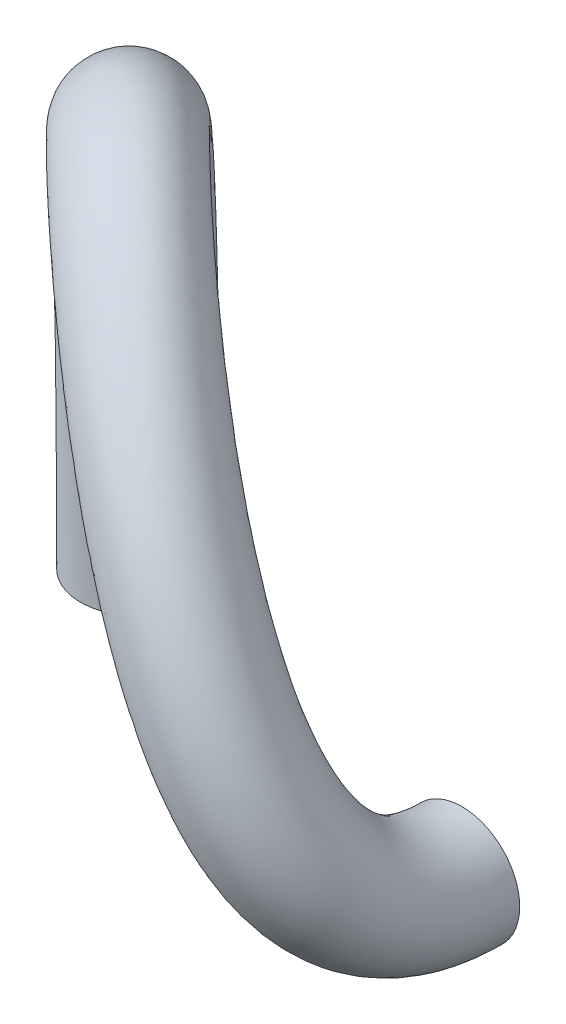
ISO-10303-21;
HEADER;
FILE_DESCRIPTION(('STEP AP214'),'2;1');
FILE_NAME('part.step','',(''),(''),'','','');
FILE_SCHEMA(('AUTOMOTIVE_DESIGN { 1 0 10303 214 1 1 1 1 }'));
ENDSEC;
DATA;
#1=APPLICATION_CONTEXT('core data for automotive mechanical design processes');
#2=APPLICATION_PROTOCOL_DEFINITION('international standard','automotive_design',2000,#1);
#3=PRODUCT_CONTEXT('',#1,'mechanical');
#4=PRODUCT('Part','Part','',(#3));
#5=PRODUCT_RELATED_PRODUCT_CATEGORY('part','',(#4));
#6=PRODUCT_DEFINITION_FORMATION('','',#4);
#7=PRODUCT_DEFINITION_CONTEXT('part definition',#1,'design');
#8=PRODUCT_DEFINITION('design','',#6,#7);
#9=PRODUCT_DEFINITION_SHAPE('','',#8);
#10=(LENGTH_UNIT() NAMED_UNIT(*) SI_UNIT(.MILLI.,.METRE.));
#11=(NAMED_UNIT(*) PLANE_ANGLE_UNIT() SI_UNIT($,.RADIAN.));
#12=(NAMED_UNIT(*) SI_UNIT($,.STERADIAN.) SOLID_ANGLE_UNIT());
#13=UNCERTAINTY_MEASURE_WITH_UNIT(LENGTH_MEASURE(1.E-05),#10,'distance_accuracy_value','');
#14=(GEOMETRIC_REPRESENTATION_CONTEXT(3) GLOBAL_UNCERTAINTY_ASSIGNED_CONTEXT((#13)) GLOBAL_UNIT_ASSIGNED_CONTEXT((#10,
#11,#12)) REPRESENTATION_CONTEXT('',''));
#15=CARTESIAN_POINT('',(0.,0.,0.));
#16=DIRECTION('',(0.,0.,1.));
#17=DIRECTION('',(1.,0.,0.));
#18=AXIS2_PLACEMENT_3D('',#15,#16,#17);
#19=CARTESIAN_POINT('',(-9.49999999999999,-0.299999999999997,-2.49999999999999));
#20=DIRECTION('',(0.,-1.,0.));
#21=DIRECTION('',(0.474248216552269,0.,-0.880391179588365));
#22=AXIS2_PLACEMENT_3D('',#19,#20,#21);
#23=PLANE('',#22);
#24=CARTESIAN_POINT('',(-9.49999999999999,-0.299999999999997,-2.49999999999999));
#25=DIRECTION('',(0.,-1.,0.));
#26=DIRECTION('',(0.474248216552269,0.,-0.880391179588365));
#27=AXIS2_PLACEMENT_3D('',#24,#25,#26);
#28=CIRCLE('',#27,1.);
#29=CARTESIAN_POINT('',(-9.02575178344772,-0.299999999999997,-3.38039117958835));
#30=VERTEX_POINT('',#29);
#31=EDGE_CURVE('E397',#30,#30,#28,.T.);
#32=ORIENTED_EDGE('',*,*,#31,.F.);
#33=EDGE_LOOP('',(#32));
#34=FACE_BOUND('',#33,.T.);
#35=CARTESIAN_POINT('',(-9.49999999999999,-0.299999999999997,-2.49999999999999));
#36=DIRECTION('',(0.,-1.,0.));
#37=DIRECTION('',(0.474248216552269,0.,-0.880391179588365));
#38=AXIS2_PLACEMENT_3D('',#35,#36,#37);
#39=CIRCLE('',#38,1.25);
#40=CARTESIAN_POINT('',(-8.90718972930965,-0.299999999999996,-3.60048897448544));
#41=VERTEX_POINT('',#40);
#42=EDGE_CURVE('E12',#41,#41,#39,.T.);
#43=ORIENTED_EDGE('',*,*,#42,.T.);
#44=EDGE_LOOP('',(#43));
#45=FACE_BOUND('',#44,.T.);
#46=ADVANCED_FACE('F387',(#34,#45),#23,.T.);
#47=CARTESIAN_POINT('',(0.,0.,0.));
#48=DIRECTION('',(0.,0.,1.));
#49=DIRECTION('',(1.,0.,0.));
#50=AXIS2_PLACEMENT_3D('',#47,#48,#49);
#51=PLANE('',#50);
#52=CARTESIAN_POINT('',(0.,0.,0.));
#53=DIRECTION('',(0.,0.,1.));
#54=DIRECTION('',(1.,0.,0.));
#55=AXIS2_PLACEMENT_3D('',#52,#53,#54);
#56=CIRCLE('',#55,1.);
#57=CARTESIAN_POINT('',(1.,0.,0.));
#58=VERTEX_POINT('',#57);
#59=EDGE_CURVE('E416',#58,#58,#56,.T.);
#60=ORIENTED_EDGE('',*,*,#59,.T.);
#61=EDGE_LOOP('',(#60));
#62=FACE_BOUND('',#61,.T.);
#63=CARTESIAN_POINT('',(0.,0.,0.));
#64=DIRECTION('',(0.,0.,1.));
#65=DIRECTION('',(1.,0.,0.));
#66=AXIS2_PLACEMENT_3D('',#63,#64,#65);
#67=CIRCLE('',#66,1.25);
#68=CARTESIAN_POINT('',(1.25,0.,0.));
#69=VERTEX_POINT('',#68);
#70=EDGE_CURVE('E420',#69,#69,#67,.T.);
#71=ORIENTED_EDGE('',*,*,#70,.F.);
#72=EDGE_LOOP('',(#71));
#73=FACE_BOUND('',#72,.T.);
#74=ADVANCED_FACE('F432',(#62,#73),#51,.F.);
#75=CARTESIAN_POINT('',(1.25,0.,0.));
#76=CARTESIAN_POINT('',(1.24970862112056,0.00421205986643976,0.235797965728358));
#77=CARTESIAN_POINT('',(1.23868885164292,0.0377964170330535,0.684509752068425));
#78=CARTESIAN_POINT('',(1.1871130287983,0.170874481548603,1.29922567809302));
#79=CARTESIAN_POINT('',(1.10190702205083,0.381268916773065,1.85070927134287));
#80=CARTESIAN_POINT('',(0.971148592284822,0.695778299322254,2.3892440019897));
#81=CARTESIAN_POINT('',(0.78515199594626,1.13297645564173,2.87991660621971));
#82=CARTESIAN_POINT('',(0.538920988186541,1.69841440460335,3.28615917670966));
#83=CARTESIAN_POINT('',(0.164117452596985,2.5397534150071,3.66541868675781));
#84=CARTESIAN_POINT('',(-0.376091514537772,3.71148214492543,3.86287774629775));
#85=CARTESIAN_POINT('',(-1.11152766483799,5.20540059419521,3.72889283597557));
#86=CARTESIAN_POINT('',(-1.92143348149286,6.68385401725332,3.28182309721424));
#87=CARTESIAN_POINT('',(-2.80000947536494,8.04232063874811,2.60503611188945));
#88=CARTESIAN_POINT('',(-3.72882981230376,9.20173940757773,1.80077097516803));
#89=CARTESIAN_POINT('',(-4.51842464706758,9.94918092158948,1.07925421876206));
#90=CARTESIAN_POINT('',(-5.15154159729115,10.3726286940105,0.479099748397859));
#91=CARTESIAN_POINT('',(-5.6274801514895,10.5869776939681,0.0164808001635653));
#92=CARTESIAN_POINT('',(-6.06434126956256,10.6696102517009,-0.41923310340228));
#93=CARTESIAN_POINT('',(-6.45747276148996,10.6345318782207,-0.820510609449403));
#94=CARTESIAN_POINT('',(-6.80155102761394,10.5073519740994,-1.17887157760459));
#95=CARTESIAN_POINT('',(-7.1270722621888,10.2790443150601,-1.52488579831164));
#96=CARTESIAN_POINT('',(-7.42618138401951,9.95075312215591,-1.84935775781965));
#97=CARTESIAN_POINT('',(-7.69582963999665,9.52595119844657,-2.14777107745317));
#98=CARTESIAN_POINT('',(-7.93636465442362,9.00605824485633,-2.41919139314772));
#99=CARTESIAN_POINT('',(-8.1495929437313,8.38818550972865,-2.66440022306256));
#100=CARTESIAN_POINT('',(-8.336744855643,7.66778756262727,-2.88366469751635));
#101=CARTESIAN_POINT('',(-8.49843573912852,6.83912097202658,-3.07667037329568));
#102=CARTESIAN_POINT('',(-8.69626558378588,5.46952092036071,-3.31744105827618));
#103=CARTESIAN_POINT('',(-8.87302035344265,3.28686464141326,-3.54199894983548));
#104=CARTESIAN_POINT('',(-8.91495827068732,0.988595556293011,-3.60451637083581));
#105=CARTESIAN_POINT('',(-8.90718972930966,-0.299999999999999,-3.60048897448546));
#106=CARTESIAN_POINT('',(1.25,-2.5,0.));
#107=CARTESIAN_POINT('',(1.25540402599961,-2.49248115786955,0.337700334793624));
#108=CARTESIAN_POINT('',(1.25577506628009,-2.45228323617492,0.990216859264267));
#109=CARTESIAN_POINT('',(1.19741362109004,-2.25005185328238,1.95851406309156));
#110=CARTESIAN_POINT('',(1.0808707823872,-1.91070863159111,2.87525664114191));
#111=CARTESIAN_POINT('',(0.886323417138282,-1.38234223560656,3.80307403329412));
#112=CARTESIAN_POINT('',(0.602716062538726,-0.64120527972011,4.65550616064957));
#113=CARTESIAN_POINT('',(0.243416027767961,0.283146235500821,5.34092337888432));
#114=CARTESIAN_POINT('',(-0.258627229347543,1.57859355042318,5.95696734477019));
#115=CARTESIAN_POINT('',(-0.879875018335043,3.22529100402451,6.28045555235365));
#116=CARTESIAN_POINT('',(-1.56907842113685,5.19290476215688,6.20159055571931));
#117=CARTESIAN_POINT('',(-2.21280035332158,7.1318093139215,5.74165460375779));
#118=CARTESIAN_POINT('',(-2.87989516786994,8.95160489350442,4.95150807844634));
#119=CARTESIAN_POINT('',(-3.67685270931287,10.5459475743814,3.92681923171875));
#120=CARTESIAN_POINT('',(-4.50887093425248,11.6374526314997,2.94185683642182));
#121=CARTESIAN_POINT('',(-5.31468340992024,12.3248593573646,2.04577577164618));
#122=CARTESIAN_POINT('',(-6.00504778451409,12.7158501356353,1.29733477325142));
#123=CARTESIAN_POINT('',(-6.72614340627049,12.9055505440717,0.523699550378622));
#124=CARTESIAN_POINT('',(-7.43440206332479,12.8765574696203,-0.239820098647145));
#125=CARTESIAN_POINT('',(-8.07886711311304,12.6607122206322,-0.943006060420432));
#126=CARTESIAN_POINT('',(-8.68420057921064,12.2503583589022,-1.6160944522501));
#127=CARTESIAN_POINT('',(-9.21184888546412,11.6774601737943,-2.21745960943006));
#128=CARTESIAN_POINT('',(-9.64925181734453,10.9870787022384,-2.73086523612413));
#129=CARTESIAN_POINT('',(-10.0037717799984,10.2118269749255,-3.1611052191255));
#130=CARTESIAN_POINT('',(-10.2902042814946,9.36406295414474,-3.52172310817017));
#131=CARTESIAN_POINT('',(-10.5218579315324,8.4437068765415,-3.8252965559629));
#132=CARTESIAN_POINT('',(-10.7086370204038,7.44359866537035,-4.08119666438682));
#133=CARTESIAN_POINT('',(-10.9238945789961,5.86179105675872,-4.39186135239275));
#134=CARTESIAN_POINT('',(-11.0971692814433,3.46513217212059,-4.67768696620935));
#135=CARTESIAN_POINT('',(-11.1236598793348,1.04801806652879,-4.77349273721421));
#136=CARTESIAN_POINT('',(-11.1081676782806,-0.299999999999998,-4.78610951586613));
#137=CARTESIAN_POINT('',(-1.25,-2.5,0.));
#138=CARTESIAN_POINT('',(-1.2440132162415,-2.50090527760243,0.295705749160951));
#139=CARTESIAN_POINT('',(-1.24247666044325,-2.47755559537356,0.864233102366228));
#140=CARTESIAN_POINT('',(-1.28868415586691,-2.32569902834763,1.69096542897557));
#141=CARTESIAN_POINT('',(-1.3825639282175,-2.06172358681863,2.4653434114706));
#142=CARTESIAN_POINT('',(-1.53955531039871,-1.64637590740732,3.24760073175076));
#143=CARTESIAN_POINT('',(-1.77007816372726,-1.05758158147118,3.97619538505206));
#144=CARTESIAN_POINT('',(-2.06831266735563,-0.309115574499452,4.58809224230464));
#145=CARTESIAN_POINT('',(-2.49799494704217,0.766341389021628,5.18477240573912));
#146=CARTESIAN_POINT('',(-3.0593326142595,2.18982912371723,5.60554018997263));
#147=CARTESIAN_POINT('',(-3.72492934146086,3.97876351338868,5.78968681657878));
#148=CARTESIAN_POINT('',(-4.36309745283587,5.83261818435569,5.71853540229788));
#149=CARTESIAN_POINT('',(-4.99862621714007,7.66787611578769,5.37140985519788));
#150=CARTESIAN_POINT('',(-5.71919308470175,9.33415467763947,4.73469892672333));
#151=CARTESIAN_POINT('',(-6.45639664011372,10.4699354040015,3.99664252081864));
#152=CARTESIAN_POINT('',(-7.15564318408452,11.1688016490191,3.28416738650032));
#153=CARTESIAN_POINT('',(-7.74300740341008,11.5631046777461,2.68043636733033));
#154=CARTESIAN_POINT('',(-8.34300530073911,11.7662753975776,2.05715260608718));
#155=CARTESIAN_POINT('',(-8.92383733868471,11.7786681401756,1.44489246562246));
#156=CARTESIAN_POINT('',(-9.45059377797793,11.6330863986778,0.88054467515863));
#157=CARTESIAN_POINT('',(-9.94989248061429,11.3263882667024,0.334903391330746));
#158=CARTESIAN_POINT('',(-10.3951892424251,10.8783776325083,-0.162967233160725));
#159=CARTESIAN_POINT('',(-10.7772480929068,10.3174939950281,-0.600964300077331));
#160=CARTESIAN_POINT('',(-11.1000015822623,9.66397468635628,-0.980917473564373));
#161=CARTESIAN_POINT('',(-11.3724548384765,8.92436586777971,-1.31062842998762));
#162=CARTESIAN_POINT('',(-11.6025593313575,8.09715932657712,-1.59718695752848));
#163=CARTESIAN_POINT('',(-11.7960922088135,7.17616253881507,-1.84563944061089));
#164=CARTESIAN_POINT('',(-12.0290667447577,5.69121444902752,-2.15500678278555));
#165=CARTESIAN_POINT('',(-12.236178574558,3.39002321979248,-2.45254463913632));
#166=CARTESIAN_POINT('',(-12.2937433379602,1.02298174908608,-2.5644599955426));
#167=CARTESIAN_POINT('',(-12.2937882196612,-0.3,-2.58513156689521));
#168=CARTESIAN_POINT('',(-1.25,0.,0.));
#169=CARTESIAN_POINT('',(-1.24970862112056,-0.00421205986643963,0.193803380095685));
#170=CARTESIAN_POINT('',(-1.25956287508042,0.0125240578344114,0.558525995170387));
#171=CARTESIAN_POINT('',(-1.29898474815865,0.0952273064833535,1.03167704397704));
#172=CARTESIAN_POINT('',(-1.36152768855387,0.230253961545539,1.44079604167157));
#173=CARTESIAN_POINT('',(-1.45473013525217,0.431744627521494,1.83377070044634));
#174=CARTESIAN_POINT('',(-1.58764223031972,0.716600153890665,2.2006058306222));
#175=CARTESIAN_POINT('',(-1.77280770693705,1.10615259460308,2.53332804012997));
#176=CARTESIAN_POINT('',(-2.07525026509765,1.72750125360555,2.89322374772675));
#177=CARTESIAN_POINT('',(-2.55554911046223,2.67602026461815,3.18796238391673));
#178=CARTESIAN_POINT('',(-3.26737858516201,3.99125934542701,3.31698909683503));
#179=CARTESIAN_POINT('',(-4.07173058100714,5.38466288768751,3.25870389575433));
#180=CARTESIAN_POINT('',(-4.91874052463506,6.75859186103139,3.02493788864098));
#181=CARTESIAN_POINT('',(-5.77117018769265,7.98994651083579,2.60865067017262));
#182=CARTESIAN_POINT('',(-6.46595035292883,8.78166369409131,2.13403990315888));
#183=CARTESIAN_POINT('',(-6.99250137145542,9.21657098566495,1.717491363252));
#184=CARTESIAN_POINT('',(-7.36543977038549,9.43423223607887,1.39958239424247));
#185=CARTESIAN_POINT('',(-7.68120316403119,9.53033510520679,1.11421995230628));
#186=CARTESIAN_POINT('',(-7.94690803684987,9.53664254877603,0.864201954820203));
#187=CARTESIAN_POINT('',(-8.17327769247882,9.47972615214499,0.644679157974474));
#188=CARTESIAN_POINT('',(-8.39276416359245,9.3550742228603,0.426112045269213));
#189=CARTESIAN_POINT('',(-8.60952174098049,9.15167058086994,0.205134618449691));
#190=CARTESIAN_POINT('',(-8.8238259155589,8.8563664912362,-0.0178701414063714));
#191=CARTESIAN_POINT('',(-9.0325944566875,8.45820595628708,-0.239003647586594));
#192=CARTESIAN_POINT('',(-9.23184350071313,7.94848842336362,-0.453305544880006));
#193=CARTESIAN_POINT('',(-9.41744625546811,7.32124001266289,-0.655555099081925));
#194=CARTESIAN_POINT('',(-9.58589092753814,6.5716848454713,-0.841113149519759));
#195=CARTESIAN_POINT('',(-9.80143774954746,5.29894431262952,-1.08058648866899));
#196=CARTESIAN_POINT('',(-10.0120296465573,3.21175568908514,-1.31685662276245));
#197=CARTESIAN_POINT('',(-10.0850417293127,0.963559238850304,-1.39548362916419));
#198=CARTESIAN_POINT('',(-10.0928102706903,-0.300000000000001,-1.39951102551454));
#199=CARTESIAN_POINT('',(-1.25,2.5,0.));
#200=CARTESIAN_POINT('',(-1.25540402599961,2.49248115786955,0.091901011030419));
#201=CARTESIAN_POINT('',(-1.27664908971758,2.50260371104238,0.252818887974545));
#202=CARTESIAN_POINT('',(-1.30928534045038,2.51615364131434,0.372388658978507));
#203=CARTESIAN_POINT('',(-1.34049144889024,2.52223150990971,0.416248671872531));
#204=CARTESIAN_POINT('',(-1.36990496010563,2.5098651624503,0.419940669141913));
#205=CARTESIAN_POINT('',(-1.40520629691219,2.4907818892525,0.425016276192344));
#206=CARTESIAN_POINT('',(-1.47730274651847,2.52142076370561,0.478563837955308));
#207=CARTESIAN_POINT('',(-1.65250558315312,2.68866111818947,0.601675089714369));
#208=CARTESIAN_POINT('',(-2.05176560666496,3.16221140551908,0.770384577860827));
#209=CARTESIAN_POINT('',(-2.80982782886315,4.00375517746534,0.844291377091288));
#210=CARTESIAN_POINT('',(-3.78036370917842,4.93670759101933,0.798872389210779));
#211=CARTESIAN_POINT('',(-4.83885483213005,5.84930760627508,0.678465922084084));
#212=CARTESIAN_POINT('',(-5.82314729068354,6.64573834403213,0.482602413621904));
#213=CARTESIAN_POINT('',(-6.47550406574392,7.0933919841811,0.271437285499121));
#214=CARTESIAN_POINT('',(-6.82935955882633,7.26434032231077,0.150815340003679));
#215=CARTESIAN_POINT('',(-6.98787213736091,7.30535979441166,0.118728421154613));
#216=CARTESIAN_POINT('',(-7.01940102732326,7.29439481283597,0.171287298525375));
#217=CARTESIAN_POINT('',(-6.96997873501504,7.29461695737648,0.283511444017944));
#218=CARTESIAN_POINT('',(-6.89596160697972,7.3263659056122,0.408813640790318));
#219=CARTESIAN_POINT('',(-6.8356358465706,7.38376017901817,0.51732069920768));
#220=CARTESIAN_POINT('',(-6.82385423953587,7.42496352923156,0.573236470060106));
#221=CARTESIAN_POINT('',(-6.87040373821103,7.39523898744433,0.565224017264589));
#222=CARTESIAN_POINT('',(-6.96518733111271,7.25243722621788,0.502910178391186));
#223=CARTESIAN_POINT('',(-7.09123216294979,6.97261097894753,0.404017340227611));
#224=CARTESIAN_POINT('',(-7.23233317957874,6.54532069874867,0.286076759364625));
#225=CARTESIAN_POINT('',(-7.37568964626281,5.96720715212753,0.163413141571377));
#226=CARTESIAN_POINT('',(-7.57380875433722,4.90667417623152,-0.00616619455241969));
#227=CARTESIAN_POINT('',(-7.7878807185567,3.03348815837782,-0.181168606388584));
#228=CARTESIAN_POINT('',(-7.87634012066518,0.904136728614527,-0.226507262785787));
#229=CARTESIAN_POINT('',(-7.89183232171942,-0.300000000000002,-0.213890484133872));
#230=CARTESIAN_POINT('',(1.25,2.5,0.));
#231=CARTESIAN_POINT('',(1.2440132162415,2.50090527760243,0.133895596663093));
#232=CARTESIAN_POINT('',(1.22160263700575,2.52787607024102,0.378802644872584));
#233=CARTESIAN_POINT('',(1.17681243650657,2.59180081637959,0.63993729309449));
#234=CARTESIAN_POINT('',(1.12294326171446,2.67324646513724,0.826161901543835));
#235=CARTESIAN_POINT('',(1.05597376743136,2.77389883425106,0.975413970685272));
#236=CARTESIAN_POINT('',(0.967587929353793,2.90715819100357,1.10432705178985));
#237=CARTESIAN_POINT('',(0.834425948605122,3.11368257370588,1.23139497453499));
#238=CARTESIAN_POINT('',(0.586862134541514,3.50091327959102,1.37387002874543));
#239=CARTESIAN_POINT('',(0.127691989259499,4.19767328582636,1.44529994024185));
#240=CARTESIAN_POINT('',(-0.65397690853914,5.21789642623354,1.25619511623182));
#241=CARTESIAN_POINT('',(-1.63006660966413,6.23589872058514,0.821991590670698));
#242=CARTESIAN_POINT('',(-2.72012378285993,7.13303638399181,0.258564145332547));
#243=CARTESIAN_POINT('',(-3.78080691529466,7.85753124077406,-0.325277281382679));
#244=CARTESIAN_POINT('',(-4.52797835988268,8.26090921167927,-0.783348398897699));
#245=CARTESIAN_POINT('',(-4.98839978466206,8.42039803065627,-1.08757627485046));
#246=CARTESIAN_POINT('',(-5.24991251846492,8.45810525230086,-1.26437317292429));
#247=CARTESIAN_POINT('',(-5.40253913285464,8.43366995933007,-1.36216575718318));
#248=CARTESIAN_POINT('',(-5.48054345965513,8.39250628682116,-1.40120112025166));
#249=CARTESIAN_POINT('',(-5.52423494211484,8.35399172756661,-1.41473709478874));
#250=CARTESIAN_POINT('',(-5.56994394516696,8.30773027121799,-1.43367714437317));
#251=CARTESIAN_POINT('',(-5.6405138825749,8.22404607051753,-1.48125590620923));
#252=CARTESIAN_POINT('',(-5.74240746264878,8.0648236946547,-1.56467691878221));
#253=CARTESIAN_POINT('',(-5.86895752884883,7.80028951478713,-1.67727756716994));
#254=CARTESIAN_POINT('',(-6.00898160596796,7.41230806531256,-1.80707733795494));
#255=CARTESIAN_POINT('',(-6.15163177975363,6.89186824871304,-1.9420328390698));
#256=CARTESIAN_POINT('',(-6.28823445785318,6.23464327868281,-2.07214408220454));
#257=CARTESIAN_POINT('',(-6.46863658857564,5.07725078396271,-2.24302076415961));
#258=CARTESIAN_POINT('',(-6.64887142544199,3.10859711070593,-2.4063109334616));
#259=CARTESIAN_POINT('',(-6.70625666203983,0.929173046057233,-2.4355400044574));
#260=CARTESIAN_POINT('',(-6.70621178033875,-0.3,-2.41486843310478));
#261=CARTESIAN_POINT('',(1.25,0.,0.));
#262=CARTESIAN_POINT('',(1.24970862112056,0.00421205986643976,0.235797965728358));
#263=CARTESIAN_POINT('',(1.23868885164292,0.0377964170330535,0.684509752068425));
#264=CARTESIAN_POINT('',(1.1871130287983,0.170874481548603,1.29922567809302));
#265=CARTESIAN_POINT('',(1.10190702205083,0.381268916773065,1.85070927134287));
#266=CARTESIAN_POINT('',(0.971148592284822,0.695778299322254,2.3892440019897));
#267=CARTESIAN_POINT('',(0.78515199594626,1.13297645564173,2.87991660621971));
#268=CARTESIAN_POINT('',(0.538920988186541,1.69841440460335,3.28615917670966));
#269=CARTESIAN_POINT('',(0.164117452596985,2.5397534150071,3.66541868675781));
#270=CARTESIAN_POINT('',(-0.376091514537772,3.71148214492543,3.86287774629775));
#271=CARTESIAN_POINT('',(-1.11152766483799,5.20540059419521,3.72889283597557));
#272=CARTESIAN_POINT('',(-1.92143348149286,6.68385401725332,3.28182309721424));
#273=CARTESIAN_POINT('',(-2.80000947536494,8.04232063874811,2.60503611188945));
#274=CARTESIAN_POINT('',(-3.72882981230376,9.20173940757773,1.80077097516803));
#275=CARTESIAN_POINT('',(-4.51842464706758,9.94918092158948,1.07925421876206));
#276=CARTESIAN_POINT('',(-5.15154159729115,10.3726286940105,0.479099748397859));
#277=CARTESIAN_POINT('',(-5.6274801514895,10.5869776939681,0.0164808001635653));
#278=CARTESIAN_POINT('',(-6.06434126956256,10.6696102517009,-0.41923310340228));
#279=CARTESIAN_POINT('',(-6.45747276148996,10.6345318782207,-0.820510609449403));
#280=CARTESIAN_POINT('',(-6.80155102761394,10.5073519740994,-1.17887157760459));
#281=CARTESIAN_POINT('',(-7.1270722621888,10.2790443150601,-1.52488579831164));
#282=CARTESIAN_POINT('',(-7.42618138401951,9.95075312215591,-1.84935775781965));
#283=CARTESIAN_POINT('',(-7.69582963999665,9.52595119844657,-2.14777107745317));
#284=CARTESIAN_POINT('',(-7.93636465442362,9.00605824485633,-2.41919139314772));
#285=CARTESIAN_POINT('',(-8.1495929437313,8.38818550972865,-2.66440022306256));
#286=CARTESIAN_POINT('',(-8.336744855643,7.66778756262727,-2.88366469751635));
#287=CARTESIAN_POINT('',(-8.49843573912852,6.83912097202658,-3.07667037329568));
#288=CARTESIAN_POINT('',(-8.69626558378588,5.46952092036071,-3.31744105827618));
#289=CARTESIAN_POINT('',(-8.87302035344265,3.28686464141326,-3.54199894983548));
#290=CARTESIAN_POINT('',(-8.91495827068732,0.988595556293011,-3.60451637083581));
#291=CARTESIAN_POINT('',(-8.90718972930966,-0.299999999999999,-3.60048897448546));
#292=(BOUNDED_SURFACE() B_SPLINE_SURFACE(3,3,((#75,#76,#77,#78,#79,#80,#81,#82,#83,#84,#85,#86,
#87,#88,#89,#90,#91,#92,#93,#94,#95,#96,#97,#98,#99,#100,#101,#102,#103,#104,#105),(#106,#107,
#108,#109,#110,#111,#112,#113,#114,#115,#116,#117,#118,#119,#120,#121,#122,#123,#124,#125,#126,
#127,#128,#129,#130,#131,#132,#133,#134,#135,#136),(#137,#138,#139,#140,#141,#142,#143,#144,
#145,#146,#147,#148,#149,#150,#151,#152,#153,#154,#155,#156,#157,#158,#159,#160,#161,#162,#163,
#164,#165,#166,#167),(#168,#169,#170,#171,#172,#173,#174,#175,#176,#177,#178,#179,#180,#181,
#182,#183,#184,#185,#186,#187,#188,#189,#190,#191,#192,#193,#194,#195,#196,#197,#198),(#199,
#200,#201,#202,#203,#204,#205,#206,#207,#208,#209,#210,#211,#212,#213,#214,#215,#216,#217,#218,
#219,#220,#221,#222,#223,#224,#225,#226,#227,#228,#229),(#230,#231,#232,#233,#234,#235,#236,
#237,#238,#239,#240,#241,#242,#243,#244,#245,#246,#247,#248,#249,#250,#251,#252,#253,#254,#255,
#256,#257,#258,#259,#260),(#261,#262,#263,#264,#265,#266,#267,#268,#269,#270,#271,#272,#273,
#274,#275,#276,#277,#278,#279,#280,#281,#282,#283,#284,#285,#286,#287,#288,#289,#290,#291)),
.UNSPECIFIED.,.T.,.F.,.F.) B_SPLINE_SURFACE_WITH_KNOTS((4,3,4),(4,1,1,1,1,1,1,1,1,1,1,1,1,1,1,1,
1,1,1,1,1,1,1,1,1,1,1,1,4),(0.,0.5,1.),(0.,0.023437499999995,0.046875,0.0703125,
0.093749999999585,0.125,0.156250000000101,0.1875,0.25,0.3125,0.375,0.4375,0.5,0.562499999999622,
0.59375,0.625,0.65625,0.6796875,0.703125,0.7265625,0.75,0.773333333333334,0.796666666666667,
0.820000000000001,0.843333333333333,0.866666666666667,0.89,0.945,1.),
.UNSPECIFIED.) GEOMETRIC_REPRESENTATION_ITEM() RATIONAL_B_SPLINE_SURFACE(((1.,1.,1.,1.,1.,1.,1.,
1.,1.,1.,1.,1.,1.,1.,1.,1.,1.,1.,1.,1.,1.,1.,1.,1.,1.,1.,1.,1.,1.,1.,1.),(0.333333333333333,
0.333333333333333,0.333333333333333,0.333333333333333,0.333333333333333,0.333333333333333,
0.333333333333333,0.333333333333333,0.333333333333333,0.333333333333333,0.333333333333333,
0.333333333333333,0.333333333333333,0.333333333333333,0.333333333333333,0.333333333333333,
0.333333333333333,0.333333333333333,0.333333333333333,0.333333333333333,0.333333333333333,
0.333333333333333,0.333333333333333,0.333333333333333,0.333333333333333,0.333333333333333,
0.333333333333333,0.333333333333333,0.333333333333333,0.333333333333333,0.333333333333333),
(0.333333333333333,0.333333333333333,0.333333333333333,0.333333333333333,0.333333333333333,
0.333333333333333,0.333333333333333,0.333333333333333,0.333333333333333,0.333333333333333,
0.333333333333333,0.333333333333333,0.333333333333333,0.333333333333333,0.333333333333333,
0.333333333333333,0.333333333333333,0.333333333333333,0.333333333333333,0.333333333333333,
0.333333333333333,0.333333333333333,0.333333333333333,0.333333333333333,0.333333333333333,
0.333333333333333,0.333333333333333,0.333333333333333,0.333333333333333,0.333333333333333,
0.333333333333333),(1.,1.,1.,1.,1.,1.,1.,1.,1.,1.,1.,1.,1.,1.,1.,1.,1.,1.,1.,1.,1.,1.,1.,1.,1.,
1.,1.,1.,1.,1.,1.),(0.333333333333333,0.333333333333333,0.333333333333333,0.333333333333333,
0.333333333333333,0.333333333333333,0.333333333333333,0.333333333333333,0.333333333333333,
0.333333333333333,0.333333333333333,0.333333333333333,0.333333333333333,0.333333333333333,
0.333333333333333,0.333333333333333,0.333333333333333,0.333333333333333,0.333333333333333,
0.333333333333333,0.333333333333333,0.333333333333333,0.333333333333333,0.333333333333333,
0.333333333333333,0.333333333333333,0.333333333333333,0.333333333333333,0.333333333333333,
0.333333333333333,0.333333333333333),(0.333333333333333,0.333333333333333,0.333333333333333,
0.333333333333333,0.333333333333333,0.333333333333333,0.333333333333333,0.333333333333333,
0.333333333333333,0.333333333333333,0.333333333333333,0.333333333333333,0.333333333333333,
0.333333333333333,0.333333333333333,0.333333333333333,0.333333333333333,0.333333333333333,
0.333333333333333,0.333333333333333,0.333333333333333,0.333333333333333,0.333333333333333,
0.333333333333333,0.333333333333333,0.333333333333333,0.333333333333333,0.333333333333333,
0.333333333333333,0.333333333333333,0.333333333333333),(1.,1.,1.,1.,1.,1.,1.,1.,1.,1.,1.,1.,1.,
1.,1.,1.,1.,1.,1.,1.,1.,1.,1.,1.,1.,1.,1.,1.,1.,1.,1.))) REPRESENTATION_ITEM('') SURFACE());
#293=CARTESIAN_POINT('',(1.25,0.,0.));
#294=CARTESIAN_POINT('',(1.24970862112056,0.00421205986643976,0.235797965728358));
#295=CARTESIAN_POINT('',(1.23868885164292,0.0377964170330535,0.684509752068425));
#296=CARTESIAN_POINT('',(1.1871130287983,0.170874481548603,1.29922567809302));
#297=CARTESIAN_POINT('',(1.10190702205083,0.381268916773065,1.85070927134287));
#298=CARTESIAN_POINT('',(0.971148592284822,0.695778299322254,2.3892440019897));
#299=CARTESIAN_POINT('',(0.78515199594626,1.13297645564173,2.87991660621971));
#300=CARTESIAN_POINT('',(0.538920988186541,1.69841440460335,3.28615917670966));
#301=CARTESIAN_POINT('',(0.164117452596985,2.5397534150071,3.66541868675781));
#302=CARTESIAN_POINT('',(-0.376091514537772,3.71148214492543,3.86287774629775));
#303=CARTESIAN_POINT('',(-1.11152766483799,5.20540059419521,3.72889283597557));
#304=CARTESIAN_POINT('',(-1.92143348149286,6.68385401725332,3.28182309721424));
#305=CARTESIAN_POINT('',(-2.80000947536494,8.04232063874811,2.60503611188945));
#306=CARTESIAN_POINT('',(-3.72882981230376,9.20173940757773,1.80077097516803));
#307=CARTESIAN_POINT('',(-4.51842464706758,9.94918092158948,1.07925421876206));
#308=CARTESIAN_POINT('',(-5.15154159729115,10.3726286940105,0.479099748397859));
#309=CARTESIAN_POINT('',(-5.6274801514895,10.5869776939681,0.0164808001635653));
#310=CARTESIAN_POINT('',(-6.06434126956256,10.6696102517009,-0.41923310340228));
#311=CARTESIAN_POINT('',(-6.45747276148996,10.6345318782207,-0.820510609449403));
#312=CARTESIAN_POINT('',(-6.80155102761394,10.5073519740994,-1.17887157760459));
#313=CARTESIAN_POINT('',(-7.1270722621888,10.2790443150601,-1.52488579831164));
#314=CARTESIAN_POINT('',(-7.42618138401951,9.95075312215591,-1.84935775781965));
#315=CARTESIAN_POINT('',(-7.69582963999665,9.52595119844657,-2.14777107745317));
#316=CARTESIAN_POINT('',(-7.93636465442362,9.00605824485633,-2.41919139314772));
#317=CARTESIAN_POINT('',(-8.1495929437313,8.38818550972865,-2.66440022306256));
#318=CARTESIAN_POINT('',(-8.336744855643,7.66778756262727,-2.88366469751635));
#319=CARTESIAN_POINT('',(-8.49843573912852,6.83912097202658,-3.07667037329568));
#320=CARTESIAN_POINT('',(-8.69626558378588,5.46952092036071,-3.31744105827618));
#321=CARTESIAN_POINT('',(-8.87302035344265,3.28686464141326,-3.54199894983548));
#322=CARTESIAN_POINT('',(-8.91495827068732,0.988595556293011,-3.60451637083581));
#323=CARTESIAN_POINT('',(-8.90718972930966,-0.299999999999999,-3.60048897448546));
#324=B_SPLINE_CURVE_WITH_KNOTS('',3,(#293,#294,#295,#296,#297,#298,#299,#300,#301,#302,#303,
#304,#305,#306,#307,#308,#309,#310,#311,#312,#313,#314,#315,#316,#317,#318,#319,#320,#321,#322,
#323),.UNSPECIFIED.,.F.,.F.,(4,1,1,1,1,1,1,1,1,1,1,1,1,1,1,1,1,1,1,1,1,1,1,1,1,1,1,1,4),(0.,
0.023437499999995,0.046875,0.0703125,0.093749999999585,0.125,0.156250000000101,0.1875,0.25,
0.3125,0.375,0.4375,0.5,0.562499999999622,0.59375,0.625,0.65625,0.6796875,0.703125,0.7265625,
0.75,0.773333333333334,0.796666666666667,0.820000000000001,0.843333333333333,0.866666666666667,
0.89,0.945,1.),.UNSPECIFIED.);
#325=EDGE_CURVE('E390',#69,#41,#324,.T.);
#326=ORIENTED_EDGE('',*,*,#70,.T.);
#327=ORIENTED_EDGE('',*,*,#325,.T.);
#328=ORIENTED_EDGE('',*,*,#42,.F.);
#329=ORIENTED_EDGE('',*,*,#325,.F.);
#330=EDGE_LOOP('',(#326,#327,#328,#329));
#331=FACE_BOUND('',#330,.T.);
#332=ADVANCED_FACE('F430',(#331),#292,.F.);
#333=CARTESIAN_POINT('',(1.,0.,0.));
#334=CARTESIAN_POINT('',(0.999766896896445,0.00336964789315181,0.231598507165091));
#335=CARTESIAN_POINT('',(0.988863678970587,0.0352691811131893,0.671911376378622));
#336=CARTESIAN_POINT('',(0.938503251102609,0.163309764042078,1.27247081468143));
#337=CARTESIAN_POINT('',(0.855563550990363,0.366167421250312,1.80971794837574));
#338=CARTESIAN_POINT('',(0.728560719531123,0.669374932142178,2.33369667183536));
#339=CARTESIAN_POINT('',(0.547872573319661,1.09133882546662,2.81198552865996));
#340=CARTESIAN_POINT('',(0.307748118674182,1.63918822360333,3.21087606305169));
#341=CARTESIAN_POINT('',(-0.0598193191724777,2.45852819886694,3.5881991928547));
#342=CARTESIAN_POINT('',(-0.594037274130218,3.6079359568947,3.79538621005965));
#343=CARTESIAN_POINT('',(-1.32711275687039,5.08398646931839,3.68770246206151));
#344=CARTESIAN_POINT('',(-2.13646319144429,6.55393490429673,3.27951117706825));
#345=CARTESIAN_POINT('',(-3.01188258029195,7.91394776097644,2.6470262895646));
#346=CARTESIAN_POINT('',(-3.93306384984265,9.08056011790353,1.88155894466849));
#347=CARTESIAN_POINT('',(-4.71317721765371,9.83242919883967,1.18473278720174));
#348=CARTESIAN_POINT('',(-5.33563757470758,10.2570229231759,0.602938909883273));
#349=CARTESIAN_POINT('',(-5.8012761133791,10.4717031481791,0.154790959571456));
#350=CARTESIAN_POINT('',(-6.22602745900943,10.5556827370515,-0.265887797831424));
#351=CARTESIAN_POINT('',(-6.60641628902596,10.5247429452762,-0.652039353022443));
#352=CARTESIAN_POINT('',(-6.93872369410043,10.404589391904,-0.996516504046681));
#353=CARTESIAN_POINT('',(-7.25364145232917,10.1866473058401,-1.32978601395355));
#354=CARTESIAN_POINT('',(-7.54451541971561,9.87084486802732,-1.64390852019271));
#355=CARTESIAN_POINT('',(-7.80862926755288,9.45899272772553,-1.93478098384849));
#356=CARTESIAN_POINT('',(-8.04598763465001,8.9512730159994,-2.20117261859161));
#357=CARTESIAN_POINT('',(-8.25781799942949,8.34421580109215,-2.4432907552443));
#358=CARTESIAN_POINT('',(-8.44481499562551,7.63313280763083,-2.66085373767291));
#359=CARTESIAN_POINT('',(-8.60718125796948,6.81237735937105,-2.85311465091809));
#360=CARTESIAN_POINT('',(-8.80678280036203,5.45246325958759,-3.09375560131546));
#361=CARTESIAN_POINT('',(-8.98692128275412,3.27935374618045,-3.31948471712817));
#362=CARTESIAN_POINT('',(-9.03196661654986,0.98609192454874,-3.38361309666865));
#363=CARTESIAN_POINT('',(-9.02575178344773,-0.299999999999999,-3.38039117958836));
#364=CARTESIAN_POINT('',(1.,-2.,0.));
#365=CARTESIAN_POINT('',(1.00432322079969,-1.99398492629564,0.313120402417304));
#366=CARTESIAN_POINT('',(1.00253265068032,-1.95679454145319,0.916477062135295));
#367=CARTESIAN_POINT('',(0.946743724935999,-1.77343130382271,1.79990152268025));
#368=CARTESIAN_POINT('',(0.83873455925946,-1.46741461744103,2.62935584421497));
#369=CARTESIAN_POINT('',(0.660700579413891,-0.993121495800871,3.4647606968789));
#370=CARTESIAN_POINT('',(0.401923826593634,-0.328006562822848,4.23245717220385));
#371=CARTESIAN_POINT('',(0.0713441503393179,0.5069736883213,4.85468742479143));
#372=CARTESIAN_POINT('',(-0.398015064728101,1.68960030719981,5.42143811926461));
#373=CARTESIAN_POINT('',(-0.997064077168035,3.21898304417396,5.72944845490437));
#374=CARTESIAN_POINT('',(-1.69315336190948,5.07398980368773,5.66586063785651));
#375=CARTESIAN_POINT('',(-2.36955668890727,6.91229914163128,5.24737638230309));
#376=CARTESIAN_POINT('',(-3.07579113429595,8.64137516478148,4.52420386281012));
#377=CARTESIAN_POINT('',(-3.89148216744993,10.1559266513465,3.58239754990906));
#378=CARTESIAN_POINT('',(-4.70553424740163,11.1830465667678,2.67481488132955));
#379=CARTESIAN_POINT('',(-5.46615102481085,11.8188074538593,1.85627972848193));
#380=CARTESIAN_POINT('',(-6.10333021979877,12.1748011015129,1.17947413804174));
#381=CARTESIAN_POINT('',(-6.75546916837577,12.3444349709481,0.488458325193298));
#382=CARTESIAN_POINT('',(-7.38795973049382,12.3183634183959,-0.187486944380636));
#383=CARTESIAN_POINT('',(-7.96057656249971,12.1272775891302,-0.807824090299357));
#384=CARTESIAN_POINT('',(-8.49934410594664,11.7636985409138,-1.40275293710433));
#385=CARTESIAN_POINT('',(-8.97304942087129,11.252210509338,-1.93839000148104));
#386=CARTESIAN_POINT('',(-9.37136700943118,10.627894730759,-2.40125631078526));
#387=CARTESIAN_POINT('',(-9.69991333510984,9.91588800005476,-2.79470367937384));
#388=CARTESIAN_POINT('',(-9.97030706964016,9.12491775662502,-3.1291490633304));
#389=CARTESIAN_POINT('',(-10.192905456337,8.25386825876221,-3.41415922443015));
#390=CARTESIAN_POINT('',(-10.3753422829897,7.29595951404607,-3.656735683791));
#391=CARTESIAN_POINT('',(-10.5888859965302,5.766279368706,-3.95329183660872));
#392=CARTESIAN_POINT('',(-10.7662404251546,3.42196777074632,-4.22803513022727));
#393=CARTESIAN_POINT('',(-10.7989279034679,1.03362993273736,-4.31879418977137));
#394=CARTESIAN_POINT('',(-10.7865341426245,-0.299999999999998,-4.3288876126929));
#395=CARTESIAN_POINT('',(-1.,-2.,0.));
#396=CARTESIAN_POINT('',(-0.995210572993201,-2.00072422208194,0.279524733911165));
#397=CARTESIAN_POINT('',(-0.996068730698347,-1.9770124288121,0.815690056616864));
#398=CARTESIAN_POINT('',(-1.04213449662956,-1.83394904387491,1.58586261538747));
#399=CARTESIAN_POINT('',(-1.1320132092243,-1.58822658162305,2.30142526047793));
#400=CARTESIAN_POINT('',(-1.2800024026157,-1.20434843324148,3.02038205564421));
#401=CARTESIAN_POINT('',(-1.49631155441915,-0.661107604223701,3.68900855172584));
#402=CARTESIAN_POINT('',(-1.77803880575956,0.0331642403210815,4.25242251552768));
#403=CARTESIAN_POINT('',(-2.1895092388838,1.03979857807857,4.80368216803975));
#404=CARTESIAN_POINT('',(-2.7406301539076,2.39061353992814,5.18951616499955));
#405=CARTESIAN_POINT('',(-3.41783409816869,4.10267680467317,5.33633764654408));
#406=CARTESIAN_POINT('',(-4.08979436851869,5.87294623797863,5.22888102113516));
#407=CARTESIAN_POINT('',(-4.77077597371206,7.6143921426081,4.86012528421135));
#408=CARTESIAN_POINT('',(-5.52535446776104,9.18649233395293,4.22870130591273));
#409=CARTESIAN_POINT('',(-6.26355481209062,10.2490327847693,3.518643428847));
#410=CARTESIAN_POINT('',(-6.93891884414227,10.8939612871829,2.84699302036524));
#411=CARTESIAN_POINT('',(-7.49369791491556,11.2526047352016,2.28595541330487));
#412=CARTESIAN_POINT('',(-8.04895868395066,11.4330148537529,1.71522076976014));
#413=CARTESIAN_POINT('',(-8.57950795078175,11.4400519548401,1.16028310703505));
#414=CARTESIAN_POINT('',(-9.05795789439162,11.3051769315667,0.651016498163892));
#415=CARTESIAN_POINT('',(-9.51189762706955,11.024522467154,0.158045337760355));
#416=CARTESIAN_POINT('',(-9.91972170644008,10.6129444763092,-0.294796100465575));
#417=CARTESIAN_POINT('',(-10.273764029881,10.0922269649907,-0.697335561947819));
#418=CARTESIAN_POINT('',(-10.5768971769209,9.47760616919936,-1.05055348292493));
#419=CARTESIAN_POINT('',(-10.8361075152256,8.773160087533,-1.36027332078435));
#420=CARTESIAN_POINT('',(-11.0574665761971,7.97663021879071,-1.63167154568261));
#421=CARTESIAN_POINT('',(-11.2453064337174,7.08201061280185,-1.86828990477026));
#422=CARTESIAN_POINT('',(-11.4730237291395,5.62981808252104,-2.16380818092296));
#423=CARTESIAN_POINT('',(-11.6774478596464,3.36188060888382,-2.44792126856885));
#424=CARTESIAN_POINT('',(-11.7349946703681,1.0136008787832,-2.55156799643408));
#425=CARTESIAN_POINT('',(-11.735030575729,-0.3,-2.56810525351617));
#426=CARTESIAN_POINT('',(-1.,0.,0.));
#427=CARTESIAN_POINT('',(-0.999766896896445,-0.00336964789315171,0.198002838658952));
#428=CARTESIAN_POINT('',(-1.00973770240808,0.0150512937542756,0.571124370860191));
#429=CARTESIAN_POINT('',(-1.05037497046295,0.102792023989878,1.05843190738864));
#430=CARTESIAN_POINT('',(-1.1151842174934,0.245355457068291,1.4817873646387));
#431=CARTESIAN_POINT('',(-1.21214226249847,0.45814799470157,1.88931803060067));
#432=CARTESIAN_POINT('',(-1.35036280769313,0.758237784065772,2.26853690818195));
#433=CARTESIAN_POINT('',(-1.54163483742469,1.16537877560311,2.60861115378794));
#434=CARTESIAN_POINT('',(-1.85131349332818,1.8087264697457,2.97044324162985));
#435=CARTESIAN_POINT('',(-2.33760335086978,2.77956645264888,3.25545392015483));
#436=CARTESIAN_POINT('',(-3.05179349312961,4.11267347030383,3.35817947074909));
#437=CARTESIAN_POINT('',(-3.85670087105571,5.51458200064409,3.26101581590032));
#438=CARTESIAN_POINT('',(-4.70686741970805,6.88696473880306,2.98294771096583));
#439=CARTESIAN_POINT('',(-5.56693615015376,8.11112580050999,2.52786270067216));
#440=CARTESIAN_POINT('',(-6.2711977823427,8.89841541684113,2.0285613347192));
#441=CARTESIAN_POINT('',(-6.808405394039,9.33217675649951,1.59365220176658));
#442=CARTESIAN_POINT('',(-7.1916438084959,9.54950678186779,1.26127223483458));
#443=CARTESIAN_POINT('',(-7.51951697458432,9.6442626198562,0.960874646735421));
#444=CARTESIAN_POINT('',(-7.79796450931388,9.6464314817205,0.695730698393242));
#445=CARTESIAN_POINT('',(-8.03610502599233,9.58248873434044,0.462324084416568));
#446=CARTESIAN_POINT('',(-8.26619497345208,9.44747123208028,0.231012260911128));
#447=CARTESIAN_POINT('',(-8.49118770528439,9.23157883499854,-0.000314619177242769));
#448=CARTESIAN_POINT('',(-8.71102628800268,8.92332496195724,-0.230860235011051));
#449=CARTESIAN_POINT('',(-8.92297147646111,8.512991185144,-0.457022422142707));
#450=CARTESIAN_POINT('',(-9.12361844501495,7.99245813200012,-0.674415012698261));
#451=CARTESIAN_POINT('',(-9.3093761154856,7.35589476765933,-0.878366058925367));
#452=CARTESIAN_POINT('',(-9.47714540869718,6.59842845812683,-1.06466887189735));
#453=CARTESIAN_POINT('',(-9.6909205329713,5.31600197340264,-1.30427194562971));
#454=CARTESIAN_POINT('',(-9.89812871724588,3.21926658431796,-1.53937085546976));
#455=CARTESIAN_POINT('',(-9.96803338345014,0.966062870594575,-1.61638690333135));
#456=CARTESIAN_POINT('',(-9.97424821655227,-0.300000000000001,-1.61960882041163));
#457=CARTESIAN_POINT('',(-1.,2.,0.));
#458=CARTESIAN_POINT('',(-1.00432322079969,1.99398492629564,0.11648094340674));
#459=CARTESIAN_POINT('',(-1.02340667411782,2.00711501632065,0.326558685103517));
#460=CARTESIAN_POINT('',(-1.05861544429634,2.03953309185467,0.531001199389812));
#461=CARTESIAN_POINT('',(-1.09835522576249,2.07893749575963,0.662149468799469));
#462=CARTESIAN_POINT('',(-1.14428212238124,2.12064442264462,0.758254005557134));
#463=CARTESIAN_POINT('',(-1.2044140609671,2.17758317235524,0.848065264638066));
#464=CARTESIAN_POINT('',(-1.30523086908983,2.29759331088513,0.964799792048209));
#465=CARTESIAN_POINT('',(-1.51311774777256,2.57765436141284,1.13720431521995));
#466=CARTESIAN_POINT('',(-1.93457654783196,3.16851936536962,1.32139167531011));
#467=CARTESIAN_POINT('',(-2.68575288809052,4.1226701359345,1.38002129495409));
#468=CARTESIAN_POINT('',(-3.62360737359273,5.15621776330955,1.29315061066548));
#469=CARTESIAN_POINT('',(-4.64295886570404,6.15953733499801,1.10577013772031));
#470=CARTESIAN_POINT('',(-5.60851783254648,7.03575926706706,0.827024095431588));
#471=CARTESIAN_POINT('',(-6.27884075259478,7.54779804891295,0.53847924059139));
#472=CARTESIAN_POINT('',(-6.67789194393572,7.77039222581616,0.34031138316793));
#473=CARTESIAN_POINT('',(-6.88958970207623,7.84640882853402,0.236589056364294));
#474=CARTESIAN_POINT('',(-6.99007526521798,7.85551038595954,0.2065285237107));
#475=CARTESIAN_POINT('',(-7.01642106784602,7.85281100860086,0.231178289751435));
#476=CARTESIAN_POINT('',(-7.01425215759306,7.85980053711421,0.273631670669243));
#477=CARTESIAN_POINT('',(-7.0204923198346,7.87041999700658,0.303979184061902));
#478=CARTESIAN_POINT('',(-7.0626537041287,7.85021319368784,0.294166862111089));
#479=CARTESIAN_POINT('',(-7.14828854612437,7.75442295892374,0.235615091925717));
#480=CARTESIAN_POINT('',(-7.26904577600128,7.54837620108865,0.136508638639517));
#481=CARTESIAN_POINT('',(-7.41112937480428,7.21175617646725,0.0114432953878329));
#482=CARTESIAN_POINT('',(-7.5612856547741,6.73515931652795,-0.125060572168128));
#483=CARTESIAN_POINT('',(-7.70898438367691,6.11484630345181,-0.261047839024442));
#484=CARTESIAN_POINT('',(-7.90881733680311,5.00218586428424,-0.444735710336453));
#485=CARTESIAN_POINT('',(-8.11880957484535,3.07665255975209,-0.63082044237066));
#486=CARTESIAN_POINT('',(-8.20107209653214,0.918524862405953,-0.68120581022863));
#487=CARTESIAN_POINT('',(-8.21346585737554,-0.300000000000001,-0.671112387307098));
#488=CARTESIAN_POINT('',(1.,2.,0.));
#489=CARTESIAN_POINT('',(0.995210572993201,2.00072422208194,0.150076611912878));
#490=CARTESIAN_POINT('',(0.975194707260852,2.02733290367956,0.427345690621948));
#491=CARTESIAN_POINT('',(0.930262777269219,2.10005083190687,0.745040106682599));
#492=CARTESIAN_POINT('',(0.872392542721267,2.19974945994165,0.990080052536512));
#493=CARTESIAN_POINT('',(0.796420859648354,2.33187136008523,1.20263264679182));
#494=CARTESIAN_POINT('',(0.693821320045688,2.5106842137561,1.39151388511607));
#495=CARTESIAN_POINT('',(0.544152087009046,2.77140275888535,1.56706470131196));
#496=CARTESIAN_POINT('',(0.278376426383145,3.22745609053408,1.7549602664448));
#497=CARTESIAN_POINT('',(-0.191010471092401,3.99688886961544,1.86132396521493));
#498=CARTESIAN_POINT('',(-0.961072151831312,5.09398313494906,1.70954428626652));
#499=CARTESIAN_POINT('',(-1.9033696939813,6.19557066696219,1.31164597183342));
#500=CARTESIAN_POINT('',(-2.94797402628794,7.1865203571714,0.769848716319081));
#501=CARTESIAN_POINT('',(-3.97464553223537,8.0051935844606,0.180720339427922));
#502=CARTESIAN_POINT('',(-4.72082018790579,8.48181183091149,-0.305349306926065));
#503=CARTESIAN_POINT('',(-5.2051241246043,8.69523839249256,-0.650401908715382));
#504=CARTESIAN_POINT('',(-5.49922200695944,8.76860519484537,-0.869892218898831));
#505=CARTESIAN_POINT('',(-5.69658574964309,8.76693050315482,-1.02023392085615));
#506=CARTESIAN_POINT('',(-5.82487284755809,8.7311224721566,-1.11659176166425));
#507=CARTESIAN_POINT('',(-5.91687082570115,8.68190119467773,-1.18520891779401));
#508=CARTESIAN_POINT('',(-6.00793879871169,8.60959607076643,-1.25681909080278));
#509=CARTESIAN_POINT('',(-6.11598141855992,8.48947922671661,-1.34942703890438));
#510=CARTESIAN_POINT('',(-6.24589152567458,8.29009072469203,-1.46830565691172));
#511=CARTESIAN_POINT('',(-6.39206193419018,7.98665803194405,-1.60764155780939));
#512=CARTESIAN_POINT('',(-6.54532892921881,7.56351384555928,-1.75743244715821));
#513=CARTESIAN_POINT('',(-6.69672453491402,7.01239735649945,-1.90754825091567));
#514=CARTESIAN_POINT('',(-6.83902023294921,6.32879520469603,-2.04949361804518));
#515=CARTESIAN_POINT('',(-7.02467960419384,5.13864715046919,-2.23421936602221));
#516=CARTESIAN_POINT('',(-7.20760214035359,3.13673972161459,-2.41093430402908));
#517=CARTESIAN_POINT('',(-7.26500532963186,0.938553916360118,-2.44843200356592));
#518=CARTESIAN_POINT('',(-7.264969424271,-0.3,-2.43189474648383));
#519=CARTESIAN_POINT('',(1.,0.,0.));
#520=CARTESIAN_POINT('',(0.999766896896445,0.00336964789315181,0.231598507165091));
#521=CARTESIAN_POINT('',(0.988863678970587,0.0352691811131893,0.671911376378622));
#522=CARTESIAN_POINT('',(0.938503251102609,0.163309764042078,1.27247081468143));
#523=CARTESIAN_POINT('',(0.855563550990363,0.366167421250312,1.80971794837574));
#524=CARTESIAN_POINT('',(0.728560719531123,0.669374932142178,2.33369667183536));
#525=CARTESIAN_POINT('',(0.547872573319661,1.09133882546662,2.81198552865996));
#526=CARTESIAN_POINT('',(0.307748118674182,1.63918822360333,3.21087606305169));
#527=CARTESIAN_POINT('',(-0.0598193191724777,2.45852819886694,3.5881991928547));
#528=CARTESIAN_POINT('',(-0.594037274130218,3.6079359568947,3.79538621005965));
#529=CARTESIAN_POINT('',(-1.32711275687039,5.08398646931839,3.68770246206151));
#530=CARTESIAN_POINT('',(-2.13646319144429,6.55393490429673,3.27951117706825));
#531=CARTESIAN_POINT('',(-3.01188258029195,7.91394776097644,2.6470262895646));
#532=CARTESIAN_POINT('',(-3.93306384984265,9.08056011790353,1.88155894466849));
#533=CARTESIAN_POINT('',(-4.71317721765371,9.83242919883967,1.18473278720174));
#534=CARTESIAN_POINT('',(-5.33563757470758,10.2570229231759,0.602938909883273));
#535=CARTESIAN_POINT('',(-5.8012761133791,10.4717031481791,0.154790959571456));
#536=CARTESIAN_POINT('',(-6.22602745900943,10.5556827370515,-0.265887797831424));
#537=CARTESIAN_POINT('',(-6.60641628902596,10.5247429452762,-0.652039353022443));
#538=CARTESIAN_POINT('',(-6.93872369410043,10.404589391904,-0.996516504046681));
#539=CARTESIAN_POINT('',(-7.25364145232917,10.1866473058401,-1.32978601395355));
#540=CARTESIAN_POINT('',(-7.54451541971561,9.87084486802732,-1.64390852019271));
#541=CARTESIAN_POINT('',(-7.80862926755288,9.45899272772553,-1.93478098384849));
#542=CARTESIAN_POINT('',(-8.04598763465001,8.9512730159994,-2.20117261859161));
#543=CARTESIAN_POINT('',(-8.25781799942949,8.34421580109215,-2.4432907552443));
#544=CARTESIAN_POINT('',(-8.44481499562551,7.63313280763083,-2.66085373767291));
#545=CARTESIAN_POINT('',(-8.60718125796948,6.81237735937105,-2.85311465091809));
#546=CARTESIAN_POINT('',(-8.80678280036203,5.45246325958759,-3.09375560131546));
#547=CARTESIAN_POINT('',(-8.98692128275412,3.27935374618045,-3.31948471712817));
#548=CARTESIAN_POINT('',(-9.03196661654986,0.98609192454874,-3.38361309666865));
#549=CARTESIAN_POINT('',(-9.02575178344773,-0.299999999999999,-3.38039117958836));
#550=(BOUNDED_SURFACE() B_SPLINE_SURFACE(3,3,((#333,#334,#335,#336,#337,#338,#339,#340,#341,
#342,#343,#344,#345,#346,#347,#348,#349,#350,#351,#352,#353,#354,#355,#356,#357,#358,#359,#360,
#361,#362,#363),(#364,#365,#366,#367,#368,#369,#370,#371,#372,#373,#374,#375,#376,#377,#378,
#379,#380,#381,#382,#383,#384,#385,#386,#387,#388,#389,#390,#391,#392,#393,#394),(#395,#396,
#397,#398,#399,#400,#401,#402,#403,#404,#405,#406,#407,#408,#409,#410,#411,#412,#413,#414,#415,
#416,#417,#418,#419,#420,#421,#422,#423,#424,#425),(#426,#427,#428,#429,#430,#431,#432,#433,
#434,#435,#436,#437,#438,#439,#440,#441,#442,#443,#444,#445,#446,#447,#448,#449,#450,#451,#452,
#453,#454,#455,#456),(#457,#458,#459,#460,#461,#462,#463,#464,#465,#466,#467,#468,#469,#470,
#471,#472,#473,#474,#475,#476,#477,#478,#479,#480,#481,#482,#483,#484,#485,#486,#487),(#488,
#489,#490,#491,#492,#493,#494,#495,#496,#497,#498,#499,#500,#501,#502,#503,#504,#505,#506,#507,
#508,#509,#510,#511,#512,#513,#514,#515,#516,#517,#518),(#519,#520,#521,#522,#523,#524,#525,
#526,#527,#528,#529,#530,#531,#532,#533,#534,#535,#536,#537,#538,#539,#540,#541,#542,#543,#544,
#545,#546,#547,#548,#549)),.UNSPECIFIED.,.T.,.F.,.F.) B_SPLINE_SURFACE_WITH_KNOTS((4,3,4),(4,1,
1,1,1,1,1,1,1,1,1,1,1,1,1,1,1,1,1,1,1,1,1,1,1,1,1,1,4),(0.,0.5,1.),(0.,0.023437499999995,
0.046875,0.0703125,0.093749999999585,0.125,0.156250000000101,0.1875,0.25,0.3125,0.375,0.4375,
0.5,0.562499999999622,0.59375,0.625,0.65625,0.6796875,0.703125,0.7265625,0.75,0.773333333333334,
0.796666666666667,0.820000000000001,0.843333333333333,0.866666666666667,0.89,0.945,1.),
.UNSPECIFIED.) GEOMETRIC_REPRESENTATION_ITEM() RATIONAL_B_SPLINE_SURFACE(((1.,1.,1.,1.,1.,1.,1.,
1.,1.,1.,1.,1.,1.,1.,1.,1.,1.,1.,1.,1.,1.,1.,1.,1.,1.,1.,1.,1.,1.,1.,1.),(0.333333333333333,
0.333333333333333,0.333333333333333,0.333333333333333,0.333333333333333,0.333333333333333,
0.333333333333333,0.333333333333333,0.333333333333333,0.333333333333333,0.333333333333333,
0.333333333333333,0.333333333333333,0.333333333333333,0.333333333333333,0.333333333333333,
0.333333333333333,0.333333333333333,0.333333333333333,0.333333333333333,0.333333333333333,
0.333333333333333,0.333333333333333,0.333333333333333,0.333333333333333,0.333333333333333,
0.333333333333333,0.333333333333333,0.333333333333333,0.333333333333333,0.333333333333333),
(0.333333333333333,0.333333333333333,0.333333333333333,0.333333333333333,0.333333333333333,
0.333333333333333,0.333333333333333,0.333333333333333,0.333333333333333,0.333333333333333,
0.333333333333333,0.333333333333333,0.333333333333333,0.333333333333333,0.333333333333333,
0.333333333333333,0.333333333333333,0.333333333333333,0.333333333333333,0.333333333333333,
0.333333333333333,0.333333333333333,0.333333333333333,0.333333333333333,0.333333333333333,
0.333333333333333,0.333333333333333,0.333333333333333,0.333333333333333,0.333333333333333,
0.333333333333333),(1.,1.,1.,1.,1.,1.,1.,1.,1.,1.,1.,1.,1.,1.,1.,1.,1.,1.,1.,1.,1.,1.,1.,1.,1.,
1.,1.,1.,1.,1.,1.),(0.333333333333333,0.333333333333333,0.333333333333333,0.333333333333333,
0.333333333333333,0.333333333333333,0.333333333333333,0.333333333333333,0.333333333333333,
0.333333333333333,0.333333333333333,0.333333333333333,0.333333333333333,0.333333333333333,
0.333333333333333,0.333333333333333,0.333333333333333,0.333333333333333,0.333333333333333,
0.333333333333333,0.333333333333333,0.333333333333333,0.333333333333333,0.333333333333333,
0.333333333333333,0.333333333333333,0.333333333333333,0.333333333333333,0.333333333333333,
0.333333333333333,0.333333333333333),(0.333333333333333,0.333333333333333,0.333333333333333,
0.333333333333333,0.333333333333333,0.333333333333333,0.333333333333333,0.333333333333333,
0.333333333333333,0.333333333333333,0.333333333333333,0.333333333333333,0.333333333333333,
0.333333333333333,0.333333333333333,0.333333333333333,0.333333333333333,0.333333333333333,
0.333333333333333,0.333333333333333,0.333333333333333,0.333333333333333,0.333333333333333,
0.333333333333333,0.333333333333333,0.333333333333333,0.333333333333333,0.333333333333333,
0.333333333333333,0.333333333333333,0.333333333333333),(1.,1.,1.,1.,1.,1.,1.,1.,1.,1.,1.,1.,1.,
1.,1.,1.,1.,1.,1.,1.,1.,1.,1.,1.,1.,1.,1.,1.,1.,1.,1.))) REPRESENTATION_ITEM('') SURFACE());
#551=CARTESIAN_POINT('',(1.,0.,0.));
#552=CARTESIAN_POINT('',(0.999766896896445,0.00336964789315181,0.231598507165091));
#553=CARTESIAN_POINT('',(0.988863678970587,0.0352691811131893,0.671911376378622));
#554=CARTESIAN_POINT('',(0.938503251102609,0.163309764042078,1.27247081468143));
#555=CARTESIAN_POINT('',(0.855563550990363,0.366167421250312,1.80971794837574));
#556=CARTESIAN_POINT('',(0.728560719531123,0.669374932142178,2.33369667183536));
#557=CARTESIAN_POINT('',(0.547872573319661,1.09133882546662,2.81198552865996));
#558=CARTESIAN_POINT('',(0.307748118674182,1.63918822360333,3.21087606305169));
#559=CARTESIAN_POINT('',(-0.0598193191724777,2.45852819886694,3.5881991928547));
#560=CARTESIAN_POINT('',(-0.594037274130218,3.6079359568947,3.79538621005965));
#561=CARTESIAN_POINT('',(-1.32711275687039,5.08398646931839,3.68770246206151));
#562=CARTESIAN_POINT('',(-2.13646319144429,6.55393490429673,3.27951117706825));
#563=CARTESIAN_POINT('',(-3.01188258029195,7.91394776097644,2.6470262895646));
#564=CARTESIAN_POINT('',(-3.93306384984265,9.08056011790353,1.88155894466849));
#565=CARTESIAN_POINT('',(-4.71317721765371,9.83242919883967,1.18473278720174));
#566=CARTESIAN_POINT('',(-5.33563757470758,10.2570229231759,0.602938909883273));
#567=CARTESIAN_POINT('',(-5.8012761133791,10.4717031481791,0.154790959571456));
#568=CARTESIAN_POINT('',(-6.22602745900943,10.5556827370515,-0.265887797831424));
#569=CARTESIAN_POINT('',(-6.60641628902596,10.5247429452762,-0.652039353022443));
#570=CARTESIAN_POINT('',(-6.93872369410043,10.404589391904,-0.996516504046681));
#571=CARTESIAN_POINT('',(-7.25364145232917,10.1866473058401,-1.32978601395355));
#572=CARTESIAN_POINT('',(-7.54451541971561,9.87084486802732,-1.64390852019271));
#573=CARTESIAN_POINT('',(-7.80862926755288,9.45899272772553,-1.93478098384849));
#574=CARTESIAN_POINT('',(-8.04598763465001,8.9512730159994,-2.20117261859161));
#575=CARTESIAN_POINT('',(-8.25781799942949,8.34421580109215,-2.4432907552443));
#576=CARTESIAN_POINT('',(-8.44481499562551,7.63313280763083,-2.66085373767291));
#577=CARTESIAN_POINT('',(-8.60718125796948,6.81237735937105,-2.85311465091809));
#578=CARTESIAN_POINT('',(-8.80678280036203,5.45246325958759,-3.09375560131546));
#579=CARTESIAN_POINT('',(-8.98692128275412,3.27935374618045,-3.31948471712817));
#580=CARTESIAN_POINT('',(-9.03196661654986,0.98609192454874,-3.38361309666865));
#581=CARTESIAN_POINT('',(-9.02575178344773,-0.299999999999999,-3.38039117958836));
#582=B_SPLINE_CURVE_WITH_KNOTS('',3,(#551,#552,#553,#554,#555,#556,#557,#558,#559,#560,#561,
#562,#563,#564,#565,#566,#567,#568,#569,#570,#571,#572,#573,#574,#575,#576,#577,#578,#579,#580,
#581),.UNSPECIFIED.,.F.,.F.,(4,1,1,1,1,1,1,1,1,1,1,1,1,1,1,1,1,1,1,1,1,1,1,1,1,1,1,1,4),(0.,
0.023437499999995,0.046875,0.0703125,0.093749999999585,0.125,0.156250000000101,0.1875,0.25,
0.3125,0.375,0.4375,0.5,0.562499999999622,0.59375,0.625,0.65625,0.6796875,0.703125,0.7265625,
0.75,0.773333333333334,0.796666666666667,0.820000000000001,0.843333333333333,0.866666666666667,
0.89,0.945,1.),.UNSPECIFIED.);
#583=EDGE_CURVE('E418',#58,#30,#582,.T.);
#584=ORIENTED_EDGE('',*,*,#59,.F.);
#585=ORIENTED_EDGE('',*,*,#583,.T.);
#586=ORIENTED_EDGE('',*,*,#31,.T.);
#587=ORIENTED_EDGE('',*,*,#583,.F.);
#588=EDGE_LOOP('',(#584,#585,#586,#587));
#589=FACE_BOUND('',#588,.T.);
#590=ADVANCED_FACE('F417',(#589),#550,.T.);
#591=CLOSED_SHELL('',(#46,#74,#332,#590));
#592=MANIFOLD_SOLID_BREP('B2',#591);
#593=ADVANCED_BREP_SHAPE_REPRESENTATION('',(#18,#592),#14);
#594=SHAPE_DEFINITION_REPRESENTATION(#9,#593);
ENDSEC;
END-ISO-10303-21;
